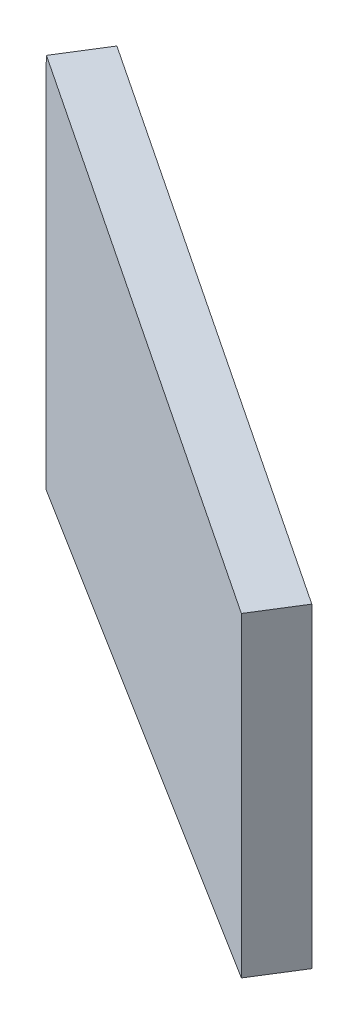
ISO-10303-21;
HEADER;
FILE_DESCRIPTION(('STEP AP214'),'2;1');
FILE_NAME('part.step','',(''),(''),'','','');
FILE_SCHEMA(('AUTOMOTIVE_DESIGN { 1 0 10303 214 1 1 1 1 }'));
ENDSEC;
DATA;
#1=APPLICATION_CONTEXT('core data for automotive mechanical design processes');
#2=APPLICATION_PROTOCOL_DEFINITION('international standard','automotive_design',2000,#1);
#3=PRODUCT_CONTEXT('',#1,'mechanical');
#4=PRODUCT('Part','Part','',(#3));
#5=PRODUCT_RELATED_PRODUCT_CATEGORY('part','',(#4));
#6=PRODUCT_DEFINITION_FORMATION('','',#4);
#7=PRODUCT_DEFINITION_CONTEXT('part definition',#1,'design');
#8=PRODUCT_DEFINITION('design','',#6,#7);
#9=PRODUCT_DEFINITION_SHAPE('','',#8);
#10=(LENGTH_UNIT() NAMED_UNIT(*) SI_UNIT(.MILLI.,.METRE.));
#11=(NAMED_UNIT(*) PLANE_ANGLE_UNIT() SI_UNIT($,.RADIAN.));
#12=(NAMED_UNIT(*) SI_UNIT($,.STERADIAN.) SOLID_ANGLE_UNIT());
#13=UNCERTAINTY_MEASURE_WITH_UNIT(LENGTH_MEASURE(1.E-05),#10,'distance_accuracy_value','');
#14=(GEOMETRIC_REPRESENTATION_CONTEXT(3) GLOBAL_UNCERTAINTY_ASSIGNED_CONTEXT((#13)) GLOBAL_UNIT_ASSIGNED_CONTEXT((#10,
#11,#12)) REPRESENTATION_CONTEXT('',''));
#15=CARTESIAN_POINT('',(0.,0.,0.));
#16=DIRECTION('',(0.,0.,1.));
#17=DIRECTION('',(1.,0.,0.));
#18=AXIS2_PLACEMENT_3D('',#15,#16,#17);
#19=CARTESIAN_POINT('',(-352.532153808327,100.844628011332,171.663434087954));
#20=DIRECTION('',(-0.84804809615643,0.,-0.529919264233198));
#21=DIRECTION('',(-0.529919264233198,0.,0.84804809615643));
#22=AXIS2_PLACEMENT_3D('',#19,#20,#21);
#23=PLANE('',#22);
#24=DIRECTION('',(0.,1.,0.));
#25=VECTOR('',#24,1.);
#26=CARTESIAN_POINT('',(-352.026161417626,4.,170.853676993683));
#27=LINE('',#26,#25);
#28=CARTESIAN_POINT('',(-352.026161417626,4.1,170.853676993684));
#29=VERTEX_POINT('',#28);
#30=CARTESIAN_POINT('',(-352.026161417626,33.0054288937195,170.853676993683));
#31=VERTEX_POINT('',#30);
#32=EDGE_CURVE('E91',#29,#31,#27,.T.);
#33=ORIENTED_EDGE('',*,*,#32,.T.);
#34=DIRECTION('',(0.529919264233198,0.,-0.84804809615643));
#35=VECTOR('',#34,1.);
#36=CARTESIAN_POINT('',(-352.532153808328,33.0054288937193,171.663434087955));
#37=LINE('',#36,#35);
#38=CARTESIAN_POINT('',(-349.906484360694,33.0054288937192,167.461484609058));
#39=VERTEX_POINT('',#38);
#40=EDGE_CURVE('E55',#31,#39,#37,.T.);
#41=ORIENTED_EDGE('',*,*,#40,.T.);
#42=DIRECTION('',(0.,1.,0.));
#43=VECTOR('',#42,1.);
#44=CARTESIAN_POINT('',(-349.906484360694,114.,167.461484609058));
#45=LINE('',#44,#43);
#46=CARTESIAN_POINT('',(-349.906484360694,4.10000000000001,167.461484609058));
#47=VERTEX_POINT('',#46);
#48=EDGE_CURVE('E97',#47,#39,#45,.T.);
#49=ORIENTED_EDGE('',*,*,#48,.F.);
#50=DIRECTION('',(-0.5299192642332,0.,0.848048096156429));
#51=VECTOR('',#50,1.);
#52=CARTESIAN_POINT('',(-349.906484360694,4.1,167.461484609058));
#53=LINE('',#52,#51);
#54=EDGE_CURVE('E101',#47,#29,#53,.T.);
#55=ORIENTED_EDGE('',*,*,#54,.T.);
#56=EDGE_LOOP('',(#33,#41,#49,#55));
#57=FACE_BOUND('',#56,.T.);
#58=ADVANCED_FACE('F33',(#57),#23,.T.);
#59=CARTESIAN_POINT('',(-357.278038075775,114.,162.85522661655));
#60=DIRECTION('',(0.529919264233199,0.,-0.84804809615643));
#61=DIRECTION('',(-0.84804809615643,0.,-0.529919264233199));
#62=AXIS2_PLACEMENT_3D('',#59,#60,#61);
#63=PLANE('',#62);
#64=DIRECTION('',(-0.843854473414549,0.0993257540756058,-0.527298797908327));
#65=VECTOR('',#64,1.);
#66=CARTESIAN_POINT('',(-363.944401528255,35.2494298105589,158.689620406407));
#67=LINE('',#66,#65);
#68=CARTESIAN_POINT('',(-309.193711023705,28.8050086551911,192.901648898573));
#69=VERTEX_POINT('',#68);
#70=CARTESIAN_POINT('',(-349.856892650191,33.5912618604637,167.49247294906));
#71=VERTEX_POINT('',#70);
#72=EDGE_CURVE('E47',#69,#71,#67,.T.);
#73=ORIENTED_EDGE('',*,*,#72,.F.);
#74=DIRECTION('',(0.,1.,0.));
#75=VECTOR('',#74,1.);
#76=CARTESIAN_POINT('',(-309.193711023705,4.1,192.901648898573));
#77=LINE('',#76,#75);
#78=CARTESIAN_POINT('',(-309.193711023705,4.1,192.901648898573));
#79=VERTEX_POINT('',#78);
#80=EDGE_CURVE('E107',#79,#69,#77,.T.);
#81=ORIENTED_EDGE('',*,*,#80,.F.);
#82=DIRECTION('',(-0.84804809615643,0.,-0.529919264233199));
#83=VECTOR('',#82,1.);
#84=CARTESIAN_POINT('',(-357.278038075775,4.10000000000001,162.85522661655));
#85=LINE('',#84,#83);
#86=EDGE_CURVE('E95',#79,#47,#85,.T.);
#87=ORIENTED_EDGE('',*,*,#86,.T.);
#88=ORIENTED_EDGE('',*,*,#48,.T.);
#89=DIRECTION('',(0.0842330166431197,0.995054970630926,0.0526346305191529));
#90=VECTOR('',#89,1.);
#91=CARTESIAN_POINT('',(-343.190529197711,112.341832049905,171.658079159203));
#92=LINE('',#91,#90);
#93=EDGE_CURVE('E109',#39,#71,#92,.T.);
#94=ORIENTED_EDGE('',*,*,#93,.T.);
#95=EDGE_LOOP('',(#73,#81,#87,#88,#94));
#96=FACE_BOUND('',#95,.T.);
#97=ADVANCED_FACE('F120',(#96),#63,.T.);
#98=CARTESIAN_POINT('',(-359.397715132708,4.,166.247419001176));
#99=DIRECTION('',(0.529919264233199,0.,-0.84804809615643));
#100=DIRECTION('',(-0.84804809615643,0.,-0.529919264233199));
#101=AXIS2_PLACEMENT_3D('',#98,#99,#100);
#102=PLANE('',#101);
#103=DIRECTION('',(0.,1.,0.));
#104=VECTOR('',#103,1.);
#105=CARTESIAN_POINT('',(-311.313388080638,4.1,196.293841283198));
#106=LINE('',#105,#104);
#107=CARTESIAN_POINT('',(-311.313388080638,4.1,196.293841283198));
#108=VERTEX_POINT('',#107);
#109=CARTESIAN_POINT('',(-311.313388080638,28.8050086551911,196.293841283198));
#110=VERTEX_POINT('',#109);
#111=EDGE_CURVE('E88',#108,#110,#106,.T.);
#112=ORIENTED_EDGE('',*,*,#111,.T.);
#113=DIRECTION('',(-0.843854473414549,0.0993257540756053,-0.527298797908327));
#114=VECTOR('',#113,1.);
#115=CARTESIAN_POINT('',(-356.84426557597,34.1642132140633,167.842991370827));
#116=LINE('',#115,#114);
#117=CARTESIAN_POINT('',(-351.976569707124,33.5912618604637,170.884665333685));
#118=VERTEX_POINT('',#117);
#119=EDGE_CURVE('E79',#110,#118,#116,.T.);
#120=ORIENTED_EDGE('',*,*,#119,.T.);
#121=DIRECTION('',(0.0842330166431197,0.995054970630926,0.0526346305191529));
#122=VECTOR('',#121,1.);
#123=CARTESIAN_POINT('',(-354.530019263861,3.42704864640043,169.289092964034));
#124=LINE('',#123,#122);
#125=EDGE_CURVE('E41',#31,#118,#124,.T.);
#126=ORIENTED_EDGE('',*,*,#125,.F.);
#127=ORIENTED_EDGE('',*,*,#32,.F.);
#128=DIRECTION('',(-0.848048096156344,0.,-0.529919264233336));
#129=VECTOR('',#128,1.);
#130=CARTESIAN_POINT('',(-311.110015040684,4.1,196.420922862876));
#131=LINE('',#130,#129);
#132=EDGE_CURVE('E92',#108,#29,#131,.T.);
#133=ORIENTED_EDGE('',*,*,#132,.F.);
#134=EDGE_LOOP('',(#112,#120,#126,#127,#133));
#135=FACE_BOUND('',#134,.T.);
#136=ADVANCED_FACE('F84',(#135),#102,.F.);
#137=CARTESIAN_POINT('',(-99.9943656155855,4.1,159.759404921541));
#138=DIRECTION('',(0.,-1.,0.));
#139=DIRECTION('',(0.,0.,-1.));
#140=AXIS2_PLACEMENT_3D('',#137,#138,#139);
#141=PLANE('',#140);
#142=ORIENTED_EDGE('',*,*,#86,.F.);
#143=DIRECTION('',(-0.5299192642332,0.,0.848048096156429));
#144=VECTOR('',#143,1.);
#145=CARTESIAN_POINT('',(-309.193711023705,4.1,192.901648898573));
#146=LINE('',#145,#144);
#147=EDGE_CURVE('E104',#79,#108,#146,.T.);
#148=ORIENTED_EDGE('',*,*,#147,.T.);
#149=ORIENTED_EDGE('',*,*,#132,.T.);
#150=ORIENTED_EDGE('',*,*,#54,.F.);
#151=EDGE_LOOP('',(#142,#148,#149,#150));
#152=FACE_BOUND('',#151,.T.);
#153=ADVANCED_FACE('F35',(#152),#141,.T.);
#154=CARTESIAN_POINT('',(-309.193711023705,4.1,192.901648898573));
#155=DIRECTION('',(0.848048096156429,0.,0.5299192642332));
#156=DIRECTION('',(0.5299192642332,0.,-0.848048096156429));
#157=AXIS2_PLACEMENT_3D('',#154,#155,#156);
#158=PLANE('',#157);
#159=DIRECTION('',(-0.529919264233199,0.,0.84804809615643));
#160=VECTOR('',#159,1.);
#161=CARTESIAN_POINT('',(-306.014195438306,28.8050086551911,187.813360321634));
#162=LINE('',#161,#160);
#163=EDGE_CURVE('E115',#69,#110,#162,.T.);
#164=ORIENTED_EDGE('',*,*,#163,.T.);
#165=ORIENTED_EDGE('',*,*,#111,.F.);
#166=ORIENTED_EDGE('',*,*,#147,.F.);
#167=ORIENTED_EDGE('',*,*,#80,.T.);
#168=EDGE_LOOP('',(#164,#165,#166,#167));
#169=FACE_BOUND('',#168,.T.);
#170=ADVANCED_FACE('F117',(#169),#158,.T.);
#171=CARTESIAN_POINT('',(-362.878961131137,32.3827839065392,188.104501271168));
#172=DIRECTION('',(-0.843854473414549,0.0993257540756063,-0.527298797908327));
#173=DIRECTION('',(-0.529919264233199,0.,0.84804809615643));
#174=AXIS2_PLACEMENT_3D('',#171,#172,#173);
#175=PLANE('',#174);
#176=DIRECTION('',(-0.529919264233199,0.,0.84804809615643));
#177=VECTOR('',#176,1.);
#178=CARTESIAN_POINT('',(-362.776661512915,33.5912618604637,188.168425167307));
#179=LINE('',#178,#177);
#180=EDGE_CURVE('E11',#71,#118,#179,.T.);
#181=ORIENTED_EDGE('',*,*,#180,.F.);
#182=ORIENTED_EDGE('',*,*,#93,.F.);
#183=ORIENTED_EDGE('',*,*,#40,.F.);
#184=ORIENTED_EDGE('',*,*,#125,.T.);
#185=EDGE_LOOP('',(#181,#182,#183,#184));
#186=FACE_BOUND('',#185,.T.);
#187=ADVANCED_FACE('F90',(#186),#175,.T.);
#188=CARTESIAN_POINT('',(-346.677377064792,33.5912618604637,162.404184372121));
#189=DIRECTION('',(-0.0842330166431192,-0.995054970630926,-0.0526346305191527));
#190=DIRECTION('',(0.996436193503338,-0.0843499393987797,0.));
#191=AXIS2_PLACEMENT_3D('',#188,#189,#190);
#192=PLANE('',#191);
#193=ORIENTED_EDGE('',*,*,#72,.T.);
#194=ORIENTED_EDGE('',*,*,#180,.T.);
#195=ORIENTED_EDGE('',*,*,#119,.F.);
#196=ORIENTED_EDGE('',*,*,#163,.F.);
#197=EDGE_LOOP('',(#193,#194,#195,#196));
#198=FACE_BOUND('',#197,.T.);
#199=ADVANCED_FACE('F78',(#198),#192,.F.);
#200=CLOSED_SHELL('',(#58,#97,#136,#153,#170,#187,#199));
#201=MANIFOLD_SOLID_BREP('B2',#200);
#202=ADVANCED_BREP_SHAPE_REPRESENTATION('',(#18,#201),#14);
#203=SHAPE_DEFINITION_REPRESENTATION(#9,#202);
ENDSEC;
END-ISO-10303-21;
